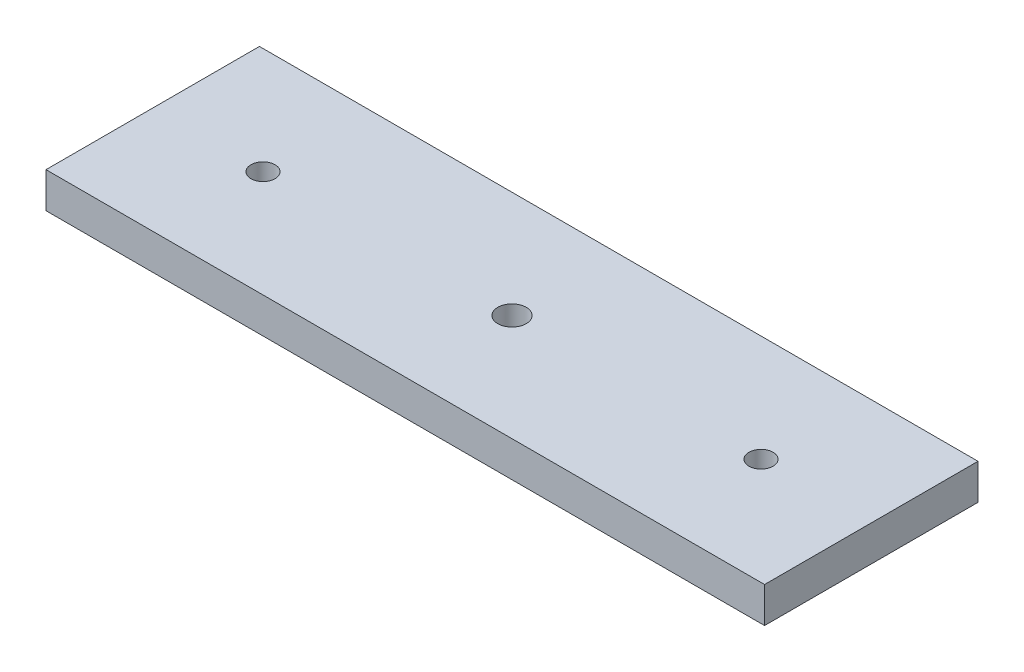
ISO-10303-21;
HEADER;
FILE_DESCRIPTION(('STEP AP214'),'2;1');
FILE_NAME('part.step','',(''),(''),'','','');
FILE_SCHEMA(('AUTOMOTIVE_DESIGN { 1 0 10303 214 1 1 1 1 }'));
ENDSEC;
DATA;
#1=APPLICATION_CONTEXT('core data for automotive mechanical design processes');
#2=APPLICATION_PROTOCOL_DEFINITION('international standard','automotive_design',2000,#1);
#3=PRODUCT_CONTEXT('',#1,'mechanical');
#4=PRODUCT('Part','Part','',(#3));
#5=PRODUCT_RELATED_PRODUCT_CATEGORY('part','',(#4));
#6=PRODUCT_DEFINITION_FORMATION('','',#4);
#7=PRODUCT_DEFINITION_CONTEXT('part definition',#1,'design');
#8=PRODUCT_DEFINITION('design','',#6,#7);
#9=PRODUCT_DEFINITION_SHAPE('','',#8);
#10=(LENGTH_UNIT() NAMED_UNIT(*) SI_UNIT(.MILLI.,.METRE.));
#11=(NAMED_UNIT(*) PLANE_ANGLE_UNIT() SI_UNIT($,.RADIAN.));
#12=(NAMED_UNIT(*) SI_UNIT($,.STERADIAN.) SOLID_ANGLE_UNIT());
#13=UNCERTAINTY_MEASURE_WITH_UNIT(LENGTH_MEASURE(1.E-05),#10,'distance_accuracy_value','');
#14=(GEOMETRIC_REPRESENTATION_CONTEXT(3) GLOBAL_UNCERTAINTY_ASSIGNED_CONTEXT((#13)) GLOBAL_UNIT_ASSIGNED_CONTEXT((#10,
#11,#12)) REPRESENTATION_CONTEXT('',''));
#15=CARTESIAN_POINT('',(0.,0.,0.));
#16=DIRECTION('',(0.,0.,1.));
#17=DIRECTION('',(1.,0.,0.));
#18=AXIS2_PLACEMENT_3D('',#15,#16,#17);
#19=CARTESIAN_POINT('',(0.,-30.,0.));
#20=DIRECTION('',(0.,-1.,0.));
#21=DIRECTION('',(0.,0.,-1.));
#22=AXIS2_PLACEMENT_3D('',#19,#20,#21);
#23=PLANE('',#22);
#24=DIRECTION('',(1.,0.,0.));
#25=VECTOR('',#24,1.);
#26=CARTESIAN_POINT('',(-640.,-30.,-1140.));
#27=LINE('',#26,#25);
#28=CARTESIAN_POINT('',(-640.,-30.,-1140.));
#29=VERTEX_POINT('',#28);
#30=CARTESIAN_POINT('',(-438.,-30.,-1140.));
#31=VERTEX_POINT('',#30);
#32=EDGE_CURVE('E92',#29,#31,#27,.T.);
#33=ORIENTED_EDGE('',*,*,#32,.T.);
#34=DIRECTION('',(0.,0.,1.));
#35=VECTOR('',#34,1.);
#36=CARTESIAN_POINT('',(-438.,-30.,-1140.));
#37=LINE('',#36,#35);
#38=CARTESIAN_POINT('',(-438.,-30.,-1200.));
#39=VERTEX_POINT('',#38);
#40=EDGE_CURVE('E71',#31,#39,#37,.F.);
#41=ORIENTED_EDGE('',*,*,#40,.T.);
#42=DIRECTION('',(1.,0.,0.));
#43=VECTOR('',#42,1.);
#44=CARTESIAN_POINT('',(-640.,-30.,-1200.));
#45=LINE('',#44,#43);
#46=CARTESIAN_POINT('',(-640.,-30.,-1200.));
#47=VERTEX_POINT('',#46);
#48=EDGE_CURVE('E54',#39,#47,#45,.F.);
#49=ORIENTED_EDGE('',*,*,#48,.T.);
#50=DIRECTION('',(0.,0.,-1.));
#51=VECTOR('',#50,1.);
#52=CARTESIAN_POINT('',(-640.,-30.,-1140.));
#53=LINE('',#52,#51);
#54=EDGE_CURVE('E59',#47,#29,#53,.F.);
#55=ORIENTED_EDGE('',*,*,#54,.T.);
#56=EDGE_LOOP('',(#33,#41,#49,#55));
#57=FACE_BOUND('',#56,.T.);
#58=CARTESIAN_POINT('',(-469.,-30.,-1170.));
#59=DIRECTION('',(0.,-1.,0.));
#60=DIRECTION('',(0.,0.,-1.));
#61=AXIS2_PLACEMENT_3D('',#58,#59,#60);
#62=CIRCLE('',#61,3.40000000000007);
#63=CARTESIAN_POINT('',(-469.,-30.,-1173.4));
#64=VERTEX_POINT('',#63);
#65=EDGE_CURVE('E68',#64,#64,#62,.T.);
#66=ORIENTED_EDGE('',*,*,#65,.T.);
#67=EDGE_LOOP('',(#66));
#68=FACE_BOUND('',#67,.T.);
#69=CARTESIAN_POINT('',(-609.,-30.,-1170.));
#70=DIRECTION('',(0.,-1.,0.));
#71=DIRECTION('',(0.,0.,-1.));
#72=AXIS2_PLACEMENT_3D('',#69,#70,#71);
#73=CIRCLE('',#72,3.39999999999985);
#74=CARTESIAN_POINT('',(-609.,-30.,-1173.4));
#75=VERTEX_POINT('',#74);
#76=EDGE_CURVE('E94',#75,#75,#73,.T.);
#77=ORIENTED_EDGE('',*,*,#76,.T.);
#78=EDGE_LOOP('',(#77));
#79=FACE_BOUND('',#78,.T.);
#80=CARTESIAN_POINT('',(-538.999999999999,-30.,-1170.));
#81=DIRECTION('',(0.,-1.,0.));
#82=DIRECTION('',(0.,0.,-1.));
#83=AXIS2_PLACEMENT_3D('',#80,#81,#82);
#84=CIRCLE('',#83,4.);
#85=CARTESIAN_POINT('',(-538.999999999999,-30.,-1174.));
#86=VERTEX_POINT('',#85);
#87=EDGE_CURVE('E19',#86,#86,#84,.T.);
#88=ORIENTED_EDGE('',*,*,#87,.T.);
#89=EDGE_LOOP('',(#88));
#90=FACE_BOUND('',#89,.T.);
#91=ADVANCED_FACE('F16',(#57,#68,#79,#90),#23,.F.);
#92=CARTESIAN_POINT('',(-538.999999999999,-40.,-1170.));
#93=DIRECTION('',(0.,-1.,0.));
#94=DIRECTION('',(0.,0.,-1.));
#95=AXIS2_PLACEMENT_3D('',#92,#93,#94);
#96=CYLINDRICAL_SURFACE('',#95,4.);
#97=CARTESIAN_POINT('',(-538.999999999999,-40.,-1170.));
#98=DIRECTION('',(0.,-1.,0.));
#99=DIRECTION('',(0.,0.,-1.));
#100=AXIS2_PLACEMENT_3D('',#97,#98,#99);
#101=CIRCLE('',#100,4.);
#102=CARTESIAN_POINT('',(-538.999999999999,-40.,-1174.));
#103=VERTEX_POINT('',#102);
#104=EDGE_CURVE('E89',#103,#103,#101,.F.);
#105=ORIENTED_EDGE('',*,*,#104,.F.);
#106=EDGE_LOOP('',(#105));
#107=FACE_BOUND('',#106,.T.);
#108=ORIENTED_EDGE('',*,*,#87,.F.);
#109=EDGE_LOOP('',(#108));
#110=FACE_BOUND('',#109,.T.);
#111=ADVANCED_FACE('F102',(#107,#110),#96,.F.);
#112=CARTESIAN_POINT('',(-609.,-40.,-1170.));
#113=DIRECTION('',(0.,-1.,0.));
#114=DIRECTION('',(0.,0.,-1.));
#115=AXIS2_PLACEMENT_3D('',#112,#113,#114);
#116=CYLINDRICAL_SURFACE('',#115,3.39999999999985);
#117=CARTESIAN_POINT('',(-609.,-40.,-1170.));
#118=DIRECTION('',(0.,-1.,0.));
#119=DIRECTION('',(0.,0.,-1.));
#120=AXIS2_PLACEMENT_3D('',#117,#118,#119);
#121=CIRCLE('',#120,3.39999999999985);
#122=CARTESIAN_POINT('',(-609.,-40.,-1173.4));
#123=VERTEX_POINT('',#122);
#124=EDGE_CURVE('E86',#123,#123,#121,.F.);
#125=ORIENTED_EDGE('',*,*,#124,.F.);
#126=EDGE_LOOP('',(#125));
#127=FACE_BOUND('',#126,.T.);
#128=ORIENTED_EDGE('',*,*,#76,.F.);
#129=EDGE_LOOP('',(#128));
#130=FACE_BOUND('',#129,.T.);
#131=ADVANCED_FACE('F104',(#127,#130),#116,.F.);
#132=CARTESIAN_POINT('',(-469.,-40.,-1170.));
#133=DIRECTION('',(0.,-1.,0.));
#134=DIRECTION('',(0.,0.,-1.));
#135=AXIS2_PLACEMENT_3D('',#132,#133,#134);
#136=CYLINDRICAL_SURFACE('',#135,3.40000000000007);
#137=CARTESIAN_POINT('',(-469.,-40.,-1170.));
#138=DIRECTION('',(0.,-1.,0.));
#139=DIRECTION('',(0.,0.,-1.));
#140=AXIS2_PLACEMENT_3D('',#137,#138,#139);
#141=CIRCLE('',#140,3.40000000000007);
#142=CARTESIAN_POINT('',(-469.,-40.,-1173.4));
#143=VERTEX_POINT('',#142);
#144=EDGE_CURVE('E82',#143,#143,#141,.F.);
#145=ORIENTED_EDGE('',*,*,#144,.F.);
#146=EDGE_LOOP('',(#145));
#147=FACE_BOUND('',#146,.T.);
#148=ORIENTED_EDGE('',*,*,#65,.F.);
#149=EDGE_LOOP('',(#148));
#150=FACE_BOUND('',#149,.T.);
#151=ADVANCED_FACE('F111',(#147,#150),#136,.F.);
#152=CARTESIAN_POINT('',(-640.,-40.,-1140.));
#153=DIRECTION('',(1.,0.,0.));
#154=DIRECTION('',(0.,0.,-1.));
#155=AXIS2_PLACEMENT_3D('',#152,#153,#154);
#156=PLANE('',#155);
#157=DIRECTION('',(0.,-1.,0.));
#158=VECTOR('',#157,1.);
#159=CARTESIAN_POINT('',(-640.,-40.,-1200.));
#160=LINE('',#159,#158);
#161=CARTESIAN_POINT('',(-640.,-40.,-1200.));
#162=VERTEX_POINT('',#161);
#163=EDGE_CURVE('E61',#47,#162,#160,.T.);
#164=ORIENTED_EDGE('',*,*,#163,.T.);
#165=DIRECTION('',(0.,0.,-1.));
#166=VECTOR('',#165,1.);
#167=CARTESIAN_POINT('',(-640.,-40.,0.));
#168=LINE('',#167,#166);
#169=CARTESIAN_POINT('',(-640.,-40.,-1140.));
#170=VERTEX_POINT('',#169);
#171=EDGE_CURVE('E85',#170,#162,#168,.T.);
#172=ORIENTED_EDGE('',*,*,#171,.F.);
#173=DIRECTION('',(0.,1.,0.));
#174=VECTOR('',#173,1.);
#175=CARTESIAN_POINT('',(-640.,-40.,-1140.));
#176=LINE('',#175,#174);
#177=EDGE_CURVE('E64',#170,#29,#176,.T.);
#178=ORIENTED_EDGE('',*,*,#177,.T.);
#179=ORIENTED_EDGE('',*,*,#54,.F.);
#180=EDGE_LOOP('',(#164,#172,#178,#179));
#181=FACE_BOUND('',#180,.T.);
#182=ADVANCED_FACE('F60',(#181),#156,.F.);
#183=CARTESIAN_POINT('',(-640.,-40.,-1200.));
#184=DIRECTION('',(0.,0.,1.));
#185=DIRECTION('',(0.,-1.,0.));
#186=AXIS2_PLACEMENT_3D('',#183,#184,#185);
#187=PLANE('',#186);
#188=DIRECTION('',(0.,1.,0.));
#189=VECTOR('',#188,1.);
#190=CARTESIAN_POINT('',(-438.,-40.,-1200.));
#191=LINE('',#190,#189);
#192=CARTESIAN_POINT('',(-438.,-40.,-1200.));
#193=VERTEX_POINT('',#192);
#194=EDGE_CURVE('E73',#39,#193,#191,.F.);
#195=ORIENTED_EDGE('',*,*,#194,.T.);
#196=DIRECTION('',(1.,0.,0.));
#197=VECTOR('',#196,1.);
#198=CARTESIAN_POINT('',(0.,-40.,-1200.));
#199=LINE('',#198,#197);
#200=EDGE_CURVE('E77',#162,#193,#199,.T.);
#201=ORIENTED_EDGE('',*,*,#200,.F.);
#202=ORIENTED_EDGE('',*,*,#163,.F.);
#203=ORIENTED_EDGE('',*,*,#48,.F.);
#204=EDGE_LOOP('',(#195,#201,#202,#203));
#205=FACE_BOUND('',#204,.T.);
#206=ADVANCED_FACE('F75',(#205),#187,.F.);
#207=CARTESIAN_POINT('',(-438.,-40.,-1140.));
#208=DIRECTION('',(-1.,0.,0.));
#209=DIRECTION('',(0.,0.,1.));
#210=AXIS2_PLACEMENT_3D('',#207,#208,#209);
#211=PLANE('',#210);
#212=DIRECTION('',(0.,1.,0.));
#213=VECTOR('',#212,1.);
#214=CARTESIAN_POINT('',(-438.,-40.,-1140.));
#215=LINE('',#214,#213);
#216=CARTESIAN_POINT('',(-438.,-40.,-1140.));
#217=VERTEX_POINT('',#216);
#218=EDGE_CURVE('E34',#31,#217,#215,.F.);
#219=ORIENTED_EDGE('',*,*,#218,.T.);
#220=DIRECTION('',(0.,0.,-1.));
#221=VECTOR('',#220,1.);
#222=CARTESIAN_POINT('',(-438.,-40.,0.));
#223=LINE('',#222,#221);
#224=EDGE_CURVE('E25',#193,#217,#223,.F.);
#225=ORIENTED_EDGE('',*,*,#224,.F.);
#226=ORIENTED_EDGE('',*,*,#194,.F.);
#227=ORIENTED_EDGE('',*,*,#40,.F.);
#228=EDGE_LOOP('',(#219,#225,#226,#227));
#229=FACE_BOUND('',#228,.T.);
#230=ADVANCED_FACE('F123',(#229),#211,.F.);
#231=CARTESIAN_POINT('',(-640.,-40.,-1140.));
#232=DIRECTION('',(0.,0.,-1.));
#233=DIRECTION('',(0.,1.,0.));
#234=AXIS2_PLACEMENT_3D('',#231,#232,#233);
#235=PLANE('',#234);
#236=ORIENTED_EDGE('',*,*,#177,.F.);
#237=DIRECTION('',(1.,0.,0.));
#238=VECTOR('',#237,1.);
#239=CARTESIAN_POINT('',(0.,-40.,-1140.));
#240=LINE('',#239,#238);
#241=EDGE_CURVE('E11',#217,#170,#240,.F.);
#242=ORIENTED_EDGE('',*,*,#241,.F.);
#243=ORIENTED_EDGE('',*,*,#218,.F.);
#244=ORIENTED_EDGE('',*,*,#32,.F.);
#245=EDGE_LOOP('',(#236,#242,#243,#244));
#246=FACE_BOUND('',#245,.T.);
#247=ADVANCED_FACE('F117',(#246),#235,.F.);
#248=CARTESIAN_POINT('',(0.,-40.,0.));
#249=DIRECTION('',(0.,-1.,0.));
#250=DIRECTION('',(0.,0.,-1.));
#251=AXIS2_PLACEMENT_3D('',#248,#249,#250);
#252=PLANE('',#251);
#253=ORIENTED_EDGE('',*,*,#224,.T.);
#254=ORIENTED_EDGE('',*,*,#241,.T.);
#255=ORIENTED_EDGE('',*,*,#171,.T.);
#256=ORIENTED_EDGE('',*,*,#200,.T.);
#257=EDGE_LOOP('',(#253,#254,#255,#256));
#258=FACE_BOUND('',#257,.T.);
#259=ORIENTED_EDGE('',*,*,#144,.T.);
#260=EDGE_LOOP('',(#259));
#261=FACE_BOUND('',#260,.T.);
#262=ORIENTED_EDGE('',*,*,#124,.T.);
#263=EDGE_LOOP('',(#262));
#264=FACE_BOUND('',#263,.T.);
#265=ORIENTED_EDGE('',*,*,#104,.T.);
#266=EDGE_LOOP('',(#265));
#267=FACE_BOUND('',#266,.T.);
#268=ADVANCED_FACE('F115',(#258,#261,#264,#267),#252,.T.);
#269=CLOSED_SHELL('',(#91,#111,#131,#151,#182,#206,#230,#247,#268));
#270=MANIFOLD_SOLID_BREP('B1',#269);
#271=ADVANCED_BREP_SHAPE_REPRESENTATION('',(#18,#270),#14);
#272=SHAPE_DEFINITION_REPRESENTATION(#9,#271);
ENDSEC;
END-ISO-10303-21;
